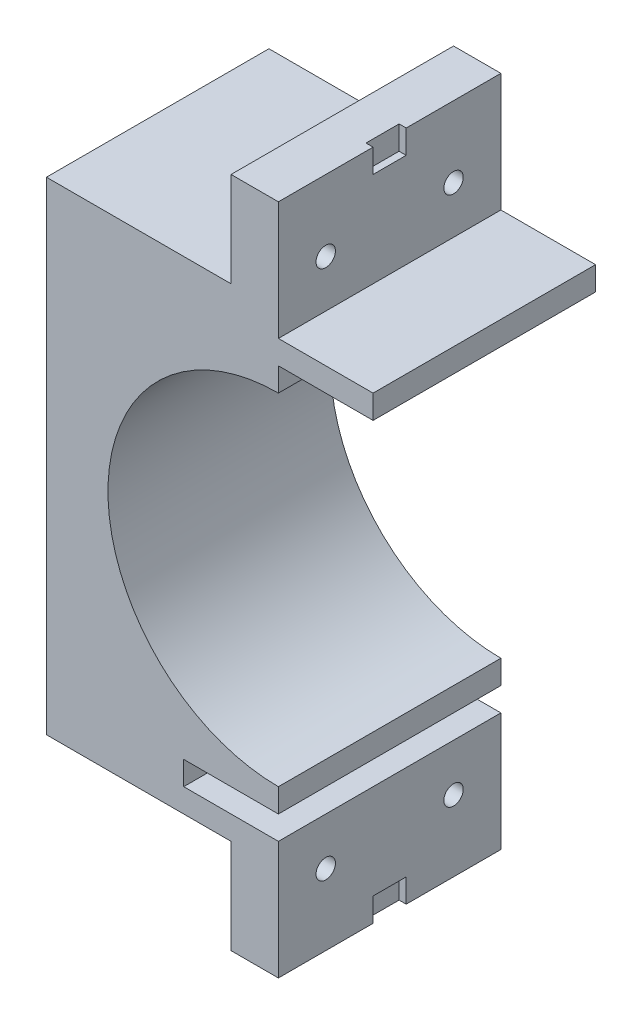
ISO-10303-21;
HEADER;
FILE_DESCRIPTION(('STEP AP214'),'2;1');
FILE_NAME('part.step','',(''),(''),'','','');
FILE_SCHEMA(('AUTOMOTIVE_DESIGN { 1 0 10303 214 1 1 1 1 }'));
ENDSEC;
DATA;
#1=APPLICATION_CONTEXT('core data for automotive mechanical design processes');
#2=APPLICATION_PROTOCOL_DEFINITION('international standard','automotive_design',2000,#1);
#3=PRODUCT_CONTEXT('',#1,'mechanical');
#4=PRODUCT('Part','Part','',(#3));
#5=PRODUCT_RELATED_PRODUCT_CATEGORY('part','',(#4));
#6=PRODUCT_DEFINITION_FORMATION('','',#4);
#7=PRODUCT_DEFINITION_CONTEXT('part definition',#1,'design');
#8=PRODUCT_DEFINITION('design','',#6,#7);
#9=PRODUCT_DEFINITION_SHAPE('','',#8);
#10=(LENGTH_UNIT() NAMED_UNIT(*) SI_UNIT(.MILLI.,.METRE.));
#11=(NAMED_UNIT(*) PLANE_ANGLE_UNIT() SI_UNIT($,.RADIAN.));
#12=(NAMED_UNIT(*) SI_UNIT($,.STERADIAN.) SOLID_ANGLE_UNIT());
#13=UNCERTAINTY_MEASURE_WITH_UNIT(LENGTH_MEASURE(1.E-05),#10,'distance_accuracy_value','');
#14=(GEOMETRIC_REPRESENTATION_CONTEXT(3) GLOBAL_UNCERTAINTY_ASSIGNED_CONTEXT((#13)) GLOBAL_UNIT_ASSIGNED_CONTEXT((#10,
#11,#12)) REPRESENTATION_CONTEXT('',''));
#15=CARTESIAN_POINT('',(0.,0.,0.));
#16=DIRECTION('',(0.,0.,1.));
#17=DIRECTION('',(1.,0.,0.));
#18=AXIS2_PLACEMENT_3D('',#15,#16,#17);
#19=CARTESIAN_POINT('',(0.,-51.,47.));
#20=DIRECTION('',(-1.,0.,0.));
#21=DIRECTION('',(0.,0.,1.));
#22=AXIS2_PLACEMENT_3D('',#19,#20,#21);
#23=PLANE('',#22);
#24=CARTESIAN_POINT('',(0.,-56.,10.));
#25=DIRECTION('',(-1.,0.,0.));
#26=DIRECTION('',(0.,0.,1.));
#27=AXIS2_PLACEMENT_3D('',#24,#25,#26);
#28=CIRCLE('',#27,2.05);
#29=CARTESIAN_POINT('',(0.,-56.,12.05));
#30=VERTEX_POINT('',#29);
#31=EDGE_CURVE('E339',#30,#30,#28,.T.);
#32=ORIENTED_EDGE('',*,*,#31,.T.);
#33=EDGE_LOOP('',(#32));
#34=FACE_BOUND('',#33,.T.);
#35=CARTESIAN_POINT('',(0.,-56.,37.));
#36=DIRECTION('',(-1.,0.,0.));
#37=DIRECTION('',(0.,0.,1.));
#38=AXIS2_PLACEMENT_3D('',#35,#36,#37);
#39=CIRCLE('',#38,2.04999999999999);
#40=CARTESIAN_POINT('',(0.,-56.,39.05));
#41=VERTEX_POINT('',#40);
#42=EDGE_CURVE('E330',#41,#41,#39,.T.);
#43=ORIENTED_EDGE('',*,*,#42,.T.);
#44=EDGE_LOOP('',(#43));
#45=FACE_BOUND('',#44,.T.);
#46=DIRECTION('',(0.,0.,1.));
#47=VECTOR('',#46,1.);
#48=CARTESIAN_POINT('',(0.,-66.,27.));
#49=LINE('',#48,#47);
#50=CARTESIAN_POINT('',(0.,-66.,20.));
#51=VERTEX_POINT('',#50);
#52=CARTESIAN_POINT('',(0.,-66.,27.));
#53=VERTEX_POINT('',#52);
#54=EDGE_CURVE('E298',#51,#53,#49,.T.);
#55=ORIENTED_EDGE('',*,*,#54,.F.);
#56=DIRECTION('',(0.,-1.,0.));
#57=VECTOR('',#56,1.);
#58=CARTESIAN_POINT('',(0.,-66.,20.));
#59=LINE('',#58,#57);
#60=CARTESIAN_POINT('',(0.,-71.,20.));
#61=VERTEX_POINT('',#60);
#62=EDGE_CURVE('E318',#51,#61,#59,.T.);
#63=ORIENTED_EDGE('',*,*,#62,.T.);
#64=DIRECTION('',(0.,0.,-1.));
#65=VECTOR('',#64,1.);
#66=CARTESIAN_POINT('',(0.,-71.,47.));
#67=LINE('',#66,#65);
#68=CARTESIAN_POINT('',(0.,-71.,0.));
#69=VERTEX_POINT('',#68);
#70=EDGE_CURVE('E428',#61,#69,#67,.T.);
#71=ORIENTED_EDGE('',*,*,#70,.T.);
#72=DIRECTION('',(0.,1.,0.));
#73=VECTOR('',#72,1.);
#74=CARTESIAN_POINT('',(0.,-51.,0.));
#75=LINE('',#74,#73);
#76=CARTESIAN_POINT('',(0.,-46.,0.));
#77=VERTEX_POINT('',#76);
#78=EDGE_CURVE('E448',#69,#77,#75,.T.);
#79=ORIENTED_EDGE('',*,*,#78,.T.);
#80=DIRECTION('',(0.,0.,1.));
#81=VECTOR('',#80,1.);
#82=CARTESIAN_POINT('',(0.,-46.,0.));
#83=LINE('',#82,#81);
#84=CARTESIAN_POINT('',(0.,-46.,47.));
#85=VERTEX_POINT('',#84);
#86=EDGE_CURVE('E368',#77,#85,#83,.T.);
#87=ORIENTED_EDGE('',*,*,#86,.T.);
#88=DIRECTION('',(0.,1.,0.));
#89=VECTOR('',#88,1.);
#90=CARTESIAN_POINT('',(0.,-51.,47.));
#91=LINE('',#90,#89);
#92=CARTESIAN_POINT('',(0.,-71.,47.));
#93=VERTEX_POINT('',#92);
#94=EDGE_CURVE('E460',#93,#85,#91,.T.);
#95=ORIENTED_EDGE('',*,*,#94,.F.);
#96=CARTESIAN_POINT('',(0.,-71.,27.));
#97=VERTEX_POINT('',#96);
#98=EDGE_CURVE('E424',#93,#97,#67,.T.);
#99=ORIENTED_EDGE('',*,*,#98,.T.);
#100=DIRECTION('',(0.,-1.,0.));
#101=VECTOR('',#100,1.);
#102=CARTESIAN_POINT('',(0.,-66.,27.));
#103=LINE('',#102,#101);
#104=EDGE_CURVE('E311',#53,#97,#103,.T.);
#105=ORIENTED_EDGE('',*,*,#104,.F.);
#106=EDGE_LOOP('',(#55,#63,#71,#79,#87,#95,#99,#105));
#107=FACE_BOUND('',#106,.T.);
#108=ADVANCED_FACE('F43',(#34,#45,#107),#23,.F.);
#109=CARTESIAN_POINT('',(0.,36.,47.));
#110=DIRECTION('',(-1.,0.,0.));
#111=DIRECTION('',(0.,0.,1.));
#112=AXIS2_PLACEMENT_3D('',#109,#110,#111);
#113=PLANE('',#112);
#114=CARTESIAN_POINT('',(0.,56.,10.));
#115=DIRECTION('',(-1.,0.,0.));
#116=DIRECTION('',(0.,0.,1.));
#117=AXIS2_PLACEMENT_3D('',#114,#115,#116);
#118=CIRCLE('',#117,2.05);
#119=CARTESIAN_POINT('',(0.,56.,12.05));
#120=VERTEX_POINT('',#119);
#121=EDGE_CURVE('E327',#120,#120,#118,.T.);
#122=ORIENTED_EDGE('',*,*,#121,.T.);
#123=EDGE_LOOP('',(#122));
#124=FACE_BOUND('',#123,.T.);
#125=CARTESIAN_POINT('',(0.,56.,37.));
#126=DIRECTION('',(-1.,0.,0.));
#127=DIRECTION('',(0.,0.,1.));
#128=AXIS2_PLACEMENT_3D('',#125,#126,#127);
#129=CIRCLE('',#128,2.04999999999999);
#130=CARTESIAN_POINT('',(0.,56.,39.05));
#131=VERTEX_POINT('',#130);
#132=EDGE_CURVE('E321',#131,#131,#129,.T.);
#133=ORIENTED_EDGE('',*,*,#132,.T.);
#134=EDGE_LOOP('',(#133));
#135=FACE_BOUND('',#134,.T.);
#136=DIRECTION('',(0.,0.,-1.));
#137=VECTOR('',#136,1.);
#138=CARTESIAN_POINT('',(0.,66.,27.));
#139=LINE('',#138,#137);
#140=CARTESIAN_POINT('',(0.,66.,27.));
#141=VERTEX_POINT('',#140);
#142=CARTESIAN_POINT('',(0.,66.,20.));
#143=VERTEX_POINT('',#142);
#144=EDGE_CURVE('E269',#141,#143,#139,.T.);
#145=ORIENTED_EDGE('',*,*,#144,.F.);
#146=DIRECTION('',(0.,1.,0.));
#147=VECTOR('',#146,1.);
#148=CARTESIAN_POINT('',(0.,66.,27.));
#149=LINE('',#148,#147);
#150=CARTESIAN_POINT('',(0.,71.,27.));
#151=VERTEX_POINT('',#150);
#152=EDGE_CURVE('E289',#141,#151,#149,.T.);
#153=ORIENTED_EDGE('',*,*,#152,.T.);
#154=DIRECTION('',(0.,0.,1.));
#155=VECTOR('',#154,1.);
#156=CARTESIAN_POINT('',(0.,71.,47.));
#157=LINE('',#156,#155);
#158=CARTESIAN_POINT('',(0.,71.,47.));
#159=VERTEX_POINT('',#158);
#160=EDGE_CURVE('E409',#151,#159,#157,.T.);
#161=ORIENTED_EDGE('',*,*,#160,.T.);
#162=DIRECTION('',(0.,1.,0.));
#163=VECTOR('',#162,1.);
#164=CARTESIAN_POINT('',(0.,36.,47.));
#165=LINE('',#164,#163);
#166=CARTESIAN_POINT('',(0.,46.,47.));
#167=VERTEX_POINT('',#166);
#168=EDGE_CURVE('E447',#167,#159,#165,.T.);
#169=ORIENTED_EDGE('',*,*,#168,.F.);
#170=DIRECTION('',(0.,0.,1.));
#171=VECTOR('',#170,1.);
#172=CARTESIAN_POINT('',(0.,46.,0.));
#173=LINE('',#172,#171);
#174=CARTESIAN_POINT('',(0.,46.,0.));
#175=VERTEX_POINT('',#174);
#176=EDGE_CURVE('E395',#175,#167,#173,.T.);
#177=ORIENTED_EDGE('',*,*,#176,.F.);
#178=DIRECTION('',(0.,1.,0.));
#179=VECTOR('',#178,1.);
#180=CARTESIAN_POINT('',(0.,36.,0.));
#181=LINE('',#180,#179);
#182=CARTESIAN_POINT('',(0.,71.,0.));
#183=VERTEX_POINT('',#182);
#184=EDGE_CURVE('E466',#175,#183,#181,.T.);
#185=ORIENTED_EDGE('',*,*,#184,.T.);
#186=CARTESIAN_POINT('',(0.,71.,20.));
#187=VERTEX_POINT('',#186);
#188=EDGE_CURVE('E413',#183,#187,#157,.T.);
#189=ORIENTED_EDGE('',*,*,#188,.T.);
#190=DIRECTION('',(0.,1.,0.));
#191=VECTOR('',#190,1.);
#192=CARTESIAN_POINT('',(0.,66.,20.));
#193=LINE('',#192,#191);
#194=EDGE_CURVE('E66',#143,#187,#193,.T.);
#195=ORIENTED_EDGE('',*,*,#194,.F.);
#196=EDGE_LOOP('',(#145,#153,#161,#169,#177,#185,#189,#195));
#197=FACE_BOUND('',#196,.T.);
#198=ADVANCED_FACE('F535',(#124,#135,#197),#113,.F.);
#199=CARTESIAN_POINT('',(0.,0.,47.));
#200=DIRECTION('',(0.,0.,-1.));
#201=DIRECTION('',(-1.,0.,0.));
#202=AXIS2_PLACEMENT_3D('',#199,#200,#201);
#203=CYLINDRICAL_SURFACE('',#202,36.);
#204=CARTESIAN_POINT('',(0.,0.,0.));
#205=DIRECTION('',(0.,0.,-1.));
#206=DIRECTION('',(1.,0.,0.));
#207=AXIS2_PLACEMENT_3D('',#204,#205,#206);
#208=CIRCLE('',#207,36.);
#209=CARTESIAN_POINT('',(0.,-36.,0.));
#210=VERTEX_POINT('',#209);
#211=CARTESIAN_POINT('',(0.,36.,0.));
#212=VERTEX_POINT('',#211);
#213=EDGE_CURVE('E443',#210,#212,#208,.T.);
#214=ORIENTED_EDGE('',*,*,#213,.T.);
#215=DIRECTION('',(0.,0.,-1.));
#216=VECTOR('',#215,1.);
#217=CARTESIAN_POINT('',(0.,36.,47.));
#218=LINE('',#217,#216);
#219=CARTESIAN_POINT('',(0.,36.,47.));
#220=VERTEX_POINT('',#219);
#221=EDGE_CURVE('E11',#220,#212,#218,.T.);
#222=ORIENTED_EDGE('',*,*,#221,.F.);
#223=CARTESIAN_POINT('',(0.,0.,47.));
#224=DIRECTION('',(0.,0.,-1.));
#225=DIRECTION('',(1.,0.,0.));
#226=AXIS2_PLACEMENT_3D('',#223,#224,#225);
#227=CIRCLE('',#226,36.);
#228=CARTESIAN_POINT('',(0.,-36.,47.));
#229=VERTEX_POINT('',#228);
#230=EDGE_CURVE('E444',#229,#220,#227,.T.);
#231=ORIENTED_EDGE('',*,*,#230,.F.);
#232=DIRECTION('',(0.,0.,-1.));
#233=VECTOR('',#232,1.);
#234=CARTESIAN_POINT('',(0.,-36.,47.));
#235=LINE('',#234,#233);
#236=EDGE_CURVE('E463',#229,#210,#235,.T.);
#237=ORIENTED_EDGE('',*,*,#236,.T.);
#238=EDGE_LOOP('',(#214,#222,#231,#237));
#239=FACE_BOUND('',#238,.T.);
#240=ADVANCED_FACE('F45',(#239),#203,.F.);
#241=CARTESIAN_POINT('',(0.,41.,0.));
#242=VERTEX_POINT('',#241);
#243=EDGE_CURVE('E467',#212,#242,#181,.T.);
#244=ORIENTED_EDGE('',*,*,#243,.T.);
#245=DIRECTION('',(0.,0.,1.));
#246=VECTOR('',#245,1.);
#247=CARTESIAN_POINT('',(0.,41.,0.));
#248=LINE('',#247,#246);
#249=CARTESIAN_POINT('',(0.,41.,47.));
#250=VERTEX_POINT('',#249);
#251=EDGE_CURVE('E387',#242,#250,#248,.T.);
#252=ORIENTED_EDGE('',*,*,#251,.T.);
#253=EDGE_CURVE('E449',#220,#250,#165,.T.);
#254=ORIENTED_EDGE('',*,*,#253,.F.);
#255=ORIENTED_EDGE('',*,*,#221,.T.);
#256=EDGE_LOOP('',(#244,#252,#254,#255));
#257=FACE_BOUND('',#256,.T.);
#258=ADVANCED_FACE('F554',(#257),#113,.F.);
#259=CARTESIAN_POINT('',(0.,51.,47.));
#260=DIRECTION('',(0.,-1.,0.));
#261=DIRECTION('',(0.,0.,-1.));
#262=AXIS2_PLACEMENT_3D('',#259,#260,#261);
#263=PLANE('',#262);
#264=DIRECTION('',(-1.,0.,0.));
#265=VECTOR('',#264,1.);
#266=CARTESIAN_POINT('',(0.,51.,47.));
#267=LINE('',#266,#265);
#268=CARTESIAN_POINT('',(-10.,51.,47.));
#269=VERTEX_POINT('',#268);
#270=CARTESIAN_POINT('',(-49.,51.,47.));
#271=VERTEX_POINT('',#270);
#272=EDGE_CURVE('E452',#269,#271,#267,.T.);
#273=ORIENTED_EDGE('',*,*,#272,.F.);
#274=DIRECTION('',(0.,0.,-1.));
#275=VECTOR('',#274,1.);
#276=CARTESIAN_POINT('',(-10.,51.,47.));
#277=LINE('',#276,#275);
#278=CARTESIAN_POINT('',(-10.,51.,0.));
#279=VERTEX_POINT('',#278);
#280=EDGE_CURVE('E415',#269,#279,#277,.T.);
#281=ORIENTED_EDGE('',*,*,#280,.T.);
#282=DIRECTION('',(-1.,0.,0.));
#283=VECTOR('',#282,1.);
#284=CARTESIAN_POINT('',(0.,51.,0.));
#285=LINE('',#284,#283);
#286=CARTESIAN_POINT('',(-49.,51.,0.));
#287=VERTEX_POINT('',#286);
#288=EDGE_CURVE('E469',#279,#287,#285,.T.);
#289=ORIENTED_EDGE('',*,*,#288,.T.);
#290=DIRECTION('',(0.,0.,-1.));
#291=VECTOR('',#290,1.);
#292=CARTESIAN_POINT('',(-49.,51.,47.));
#293=LINE('',#292,#291);
#294=EDGE_CURVE('E51',#271,#287,#293,.T.);
#295=ORIENTED_EDGE('',*,*,#294,.F.);
#296=EDGE_LOOP('',(#273,#281,#289,#295));
#297=FACE_BOUND('',#296,.T.);
#298=ADVANCED_FACE('F522',(#297),#263,.F.);
#299=CARTESIAN_POINT('',(-49.,51.,47.));
#300=DIRECTION('',(1.,0.,0.));
#301=DIRECTION('',(0.,1.,0.));
#302=AXIS2_PLACEMENT_3D('',#299,#300,#301);
#303=PLANE('',#302);
#304=DIRECTION('',(0.,-1.,0.));
#305=VECTOR('',#304,1.);
#306=CARTESIAN_POINT('',(-49.,51.,0.));
#307=LINE('',#306,#305);
#308=CARTESIAN_POINT('',(-49.,3.5,0.));
#309=VERTEX_POINT('',#308);
#310=EDGE_CURVE('E471',#287,#309,#307,.T.);
#311=ORIENTED_EDGE('',*,*,#310,.T.);
#312=DIRECTION('',(0.,0.,-1.));
#313=VECTOR('',#312,1.);
#314=CARTESIAN_POINT('',(-49.,3.5,0.));
#315=LINE('',#314,#313);
#316=CARTESIAN_POINT('',(-49.,3.5,1.8));
#317=VERTEX_POINT('',#316);
#318=EDGE_CURVE('E257',#317,#309,#315,.T.);
#319=ORIENTED_EDGE('',*,*,#318,.F.);
#320=DIRECTION('',(0.,1.,0.));
#321=VECTOR('',#320,1.);
#322=CARTESIAN_POINT('',(-49.,-3.5,1.8));
#323=LINE('',#322,#321);
#324=CARTESIAN_POINT('',(-49.,-3.5,1.8));
#325=VERTEX_POINT('',#324);
#326=EDGE_CURVE('E499',#325,#317,#323,.T.);
#327=ORIENTED_EDGE('',*,*,#326,.F.);
#328=DIRECTION('',(0.,0.,1.));
#329=VECTOR('',#328,1.);
#330=CARTESIAN_POINT('',(-49.,-3.5,0.));
#331=LINE('',#330,#329);
#332=CARTESIAN_POINT('',(-49.,-3.5,0.));
#333=VERTEX_POINT('',#332);
#334=EDGE_CURVE('E502',#333,#325,#331,.T.);
#335=ORIENTED_EDGE('',*,*,#334,.F.);
#336=CARTESIAN_POINT('',(-49.,-51.,0.));
#337=VERTEX_POINT('',#336);
#338=EDGE_CURVE('E262',#333,#337,#307,.T.);
#339=ORIENTED_EDGE('',*,*,#338,.T.);
#340=DIRECTION('',(0.,0.,-1.));
#341=VECTOR('',#340,1.);
#342=CARTESIAN_POINT('',(-49.,-51.,47.));
#343=LINE('',#342,#341);
#344=CARTESIAN_POINT('',(-49.,-51.,47.));
#345=VERTEX_POINT('',#344);
#346=EDGE_CURVE('E482',#345,#337,#343,.T.);
#347=ORIENTED_EDGE('',*,*,#346,.F.);
#348=DIRECTION('',(0.,-1.,0.));
#349=VECTOR('',#348,1.);
#350=CARTESIAN_POINT('',(-49.,51.,47.));
#351=LINE('',#350,#349);
#352=EDGE_CURVE('E454',#271,#345,#351,.T.);
#353=ORIENTED_EDGE('',*,*,#352,.F.);
#354=ORIENTED_EDGE('',*,*,#294,.T.);
#355=EDGE_LOOP('',(#311,#319,#327,#335,#339,#347,#353,#354));
#356=FACE_BOUND('',#355,.T.);
#357=ADVANCED_FACE('F489',(#356),#303,.F.);
#358=CARTESIAN_POINT('',(-49.,-51.,47.));
#359=DIRECTION('',(0.,1.,0.));
#360=DIRECTION('',(0.,0.,1.));
#361=AXIS2_PLACEMENT_3D('',#358,#359,#360);
#362=PLANE('',#361);
#363=DIRECTION('',(1.,0.,0.));
#364=VECTOR('',#363,1.);
#365=CARTESIAN_POINT('',(-49.,-51.,0.));
#366=LINE('',#365,#364);
#367=CARTESIAN_POINT('',(-10.,-51.,0.));
#368=VERTEX_POINT('',#367);
#369=EDGE_CURVE('E474',#337,#368,#366,.T.);
#370=ORIENTED_EDGE('',*,*,#369,.T.);
#371=DIRECTION('',(0.,0.,1.));
#372=VECTOR('',#371,1.);
#373=CARTESIAN_POINT('',(-10.,-51.,47.));
#374=LINE('',#373,#372);
#375=CARTESIAN_POINT('',(-10.,-51.,47.));
#376=VERTEX_POINT('',#375);
#377=EDGE_CURVE('E435',#368,#376,#374,.T.);
#378=ORIENTED_EDGE('',*,*,#377,.T.);
#379=DIRECTION('',(1.,0.,0.));
#380=VECTOR('',#379,1.);
#381=CARTESIAN_POINT('',(-49.,-51.,47.));
#382=LINE('',#381,#380);
#383=EDGE_CURVE('E456',#345,#376,#382,.T.);
#384=ORIENTED_EDGE('',*,*,#383,.F.);
#385=ORIENTED_EDGE('',*,*,#346,.T.);
#386=EDGE_LOOP('',(#370,#378,#384,#385));
#387=FACE_BOUND('',#386,.T.);
#388=ADVANCED_FACE('F510',(#387),#362,.F.);
#389=CARTESIAN_POINT('',(0.,-41.,47.));
#390=VERTEX_POINT('',#389);
#391=EDGE_CURVE('E459',#390,#229,#91,.T.);
#392=ORIENTED_EDGE('',*,*,#391,.F.);
#393=DIRECTION('',(0.,0.,1.));
#394=VECTOR('',#393,1.);
#395=CARTESIAN_POINT('',(0.,-41.,0.));
#396=LINE('',#395,#394);
#397=CARTESIAN_POINT('',(0.,-41.,0.));
#398=VERTEX_POINT('',#397);
#399=EDGE_CURVE('E361',#398,#390,#396,.T.);
#400=ORIENTED_EDGE('',*,*,#399,.F.);
#401=EDGE_CURVE('E477',#398,#210,#75,.T.);
#402=ORIENTED_EDGE('',*,*,#401,.T.);
#403=ORIENTED_EDGE('',*,*,#236,.F.);
#404=EDGE_LOOP('',(#392,#400,#402,#403));
#405=FACE_BOUND('',#404,.T.);
#406=ADVANCED_FACE('F560',(#405),#23,.F.);
#407=CARTESIAN_POINT('',(0.,0.,47.));
#408=DIRECTION('',(0.,0.,1.));
#409=DIRECTION('',(1.,0.,0.));
#410=AXIS2_PLACEMENT_3D('',#407,#408,#409);
#411=PLANE('',#410);
#412=DIRECTION('',(1.,0.,0.));
#413=VECTOR('',#412,1.);
#414=CARTESIAN_POINT('',(0.,-46.,47.));
#415=LINE('',#414,#413);
#416=CARTESIAN_POINT('',(-20.,-46.,47.));
#417=VERTEX_POINT('',#416);
#418=EDGE_CURVE('E355',#417,#85,#415,.T.);
#419=ORIENTED_EDGE('',*,*,#418,.F.);
#420=DIRECTION('',(0.,-1.,0.));
#421=VECTOR('',#420,1.);
#422=CARTESIAN_POINT('',(-20.,-41.,47.));
#423=LINE('',#422,#421);
#424=CARTESIAN_POINT('',(-20.,-41.,47.));
#425=VERTEX_POINT('',#424);
#426=EDGE_CURVE('E364',#425,#417,#423,.T.);
#427=ORIENTED_EDGE('',*,*,#426,.F.);
#428=DIRECTION('',(-1.,0.,0.));
#429=VECTOR('',#428,1.);
#430=CARTESIAN_POINT('',(0.,-41.,47.));
#431=LINE('',#430,#429);
#432=EDGE_CURVE('E342',#390,#425,#431,.T.);
#433=ORIENTED_EDGE('',*,*,#432,.F.);
#434=ORIENTED_EDGE('',*,*,#391,.T.);
#435=ORIENTED_EDGE('',*,*,#230,.T.);
#436=ORIENTED_EDGE('',*,*,#253,.T.);
#437=DIRECTION('',(1.,0.,0.));
#438=VECTOR('',#437,1.);
#439=CARTESIAN_POINT('',(0.,41.,47.));
#440=LINE('',#439,#438);
#441=CARTESIAN_POINT('',(20.,41.,47.));
#442=VERTEX_POINT('',#441);
#443=EDGE_CURVE('E371',#250,#442,#440,.T.);
#444=ORIENTED_EDGE('',*,*,#443,.T.);
#445=DIRECTION('',(0.,1.,0.));
#446=VECTOR('',#445,1.);
#447=CARTESIAN_POINT('',(20.,46.,47.));
#448=LINE('',#447,#446);
#449=CARTESIAN_POINT('',(20.,46.,47.));
#450=VERTEX_POINT('',#449);
#451=EDGE_CURVE('E390',#442,#450,#448,.T.);
#452=ORIENTED_EDGE('',*,*,#451,.T.);
#453=DIRECTION('',(-1.,0.,0.));
#454=VECTOR('',#453,1.);
#455=CARTESIAN_POINT('',(0.,46.,47.));
#456=LINE('',#455,#454);
#457=EDGE_CURVE('E381',#450,#167,#456,.T.);
#458=ORIENTED_EDGE('',*,*,#457,.T.);
#459=ORIENTED_EDGE('',*,*,#168,.T.);
#460=DIRECTION('',(-1.,0.,0.));
#461=VECTOR('',#460,1.);
#462=CARTESIAN_POINT('',(0.,71.,47.));
#463=LINE('',#462,#461);
#464=CARTESIAN_POINT('',(-10.,71.,47.));
#465=VERTEX_POINT('',#464);
#466=EDGE_CURVE('E406',#159,#465,#463,.T.);
#467=ORIENTED_EDGE('',*,*,#466,.T.);
#468=DIRECTION('',(0.,-1.,0.));
#469=VECTOR('',#468,1.);
#470=CARTESIAN_POINT('',(-10.,51.,47.));
#471=LINE('',#470,#469);
#472=EDGE_CURVE('E418',#465,#269,#471,.T.);
#473=ORIENTED_EDGE('',*,*,#472,.T.);
#474=ORIENTED_EDGE('',*,*,#272,.T.);
#475=ORIENTED_EDGE('',*,*,#352,.T.);
#476=ORIENTED_EDGE('',*,*,#383,.T.);
#477=DIRECTION('',(0.,-1.,0.));
#478=VECTOR('',#477,1.);
#479=CARTESIAN_POINT('',(-10.,-51.,47.));
#480=LINE('',#479,#478);
#481=CARTESIAN_POINT('',(-10.,-71.,47.));
#482=VERTEX_POINT('',#481);
#483=EDGE_CURVE('E421',#376,#482,#480,.T.);
#484=ORIENTED_EDGE('',*,*,#483,.T.);
#485=DIRECTION('',(-1.,0.,0.));
#486=VECTOR('',#485,1.);
#487=CARTESIAN_POINT('',(0.,-71.,47.));
#488=LINE('',#487,#486);
#489=EDGE_CURVE('E440',#93,#482,#488,.T.);
#490=ORIENTED_EDGE('',*,*,#489,.F.);
#491=ORIENTED_EDGE('',*,*,#94,.T.);
#492=EDGE_LOOP('',(#419,#427,#433,#434,#435,#436,#444,#452,#458,#459,#467,#473,#474,#475,#476,
#484,#490,#491));
#493=FACE_BOUND('',#492,.T.);
#494=ADVANCED_FACE('F519',(#493),#411,.T.);
#495=CARTESIAN_POINT('',(0.,0.,0.));
#496=DIRECTION('',(0.,0.,1.));
#497=DIRECTION('',(1.,0.,0.));
#498=AXIS2_PLACEMENT_3D('',#495,#496,#497);
#499=PLANE('',#498);
#500=DIRECTION('',(0.,-1.,0.));
#501=VECTOR('',#500,1.);
#502=CARTESIAN_POINT('',(-43.,-3.5,0.));
#503=LINE('',#502,#501);
#504=CARTESIAN_POINT('',(-43.,3.5,0.));
#505=VERTEX_POINT('',#504);
#506=CARTESIAN_POINT('',(-43.,-3.5,0.));
#507=VERTEX_POINT('',#506);
#508=EDGE_CURVE('E251',#505,#507,#503,.T.);
#509=ORIENTED_EDGE('',*,*,#508,.F.);
#510=DIRECTION('',(-1.,0.,0.));
#511=VECTOR('',#510,1.);
#512=CARTESIAN_POINT('',(-43.,3.5,0.));
#513=LINE('',#512,#511);
#514=EDGE_CURVE('E285',#505,#309,#513,.T.);
#515=ORIENTED_EDGE('',*,*,#514,.T.);
#516=ORIENTED_EDGE('',*,*,#310,.F.);
#517=ORIENTED_EDGE('',*,*,#288,.F.);
#518=DIRECTION('',(0.,1.,0.));
#519=VECTOR('',#518,1.);
#520=CARTESIAN_POINT('',(-10.,51.,0.));
#521=LINE('',#520,#519);
#522=CARTESIAN_POINT('',(-10.,71.,0.));
#523=VERTEX_POINT('',#522);
#524=EDGE_CURVE('E412',#279,#523,#521,.T.);
#525=ORIENTED_EDGE('',*,*,#524,.T.);
#526=DIRECTION('',(-1.,0.,0.));
#527=VECTOR('',#526,1.);
#528=CARTESIAN_POINT('',(0.,71.,0.));
#529=LINE('',#528,#527);
#530=EDGE_CURVE('E398',#183,#523,#529,.T.);
#531=ORIENTED_EDGE('',*,*,#530,.F.);
#532=ORIENTED_EDGE('',*,*,#184,.F.);
#533=DIRECTION('',(-1.,0.,0.));
#534=VECTOR('',#533,1.);
#535=CARTESIAN_POINT('',(0.,46.,0.));
#536=LINE('',#535,#534);
#537=CARTESIAN_POINT('',(20.,46.,0.));
#538=VERTEX_POINT('',#537);
#539=EDGE_CURVE('E384',#538,#175,#536,.T.);
#540=ORIENTED_EDGE('',*,*,#539,.F.);
#541=DIRECTION('',(0.,1.,0.));
#542=VECTOR('',#541,1.);
#543=CARTESIAN_POINT('',(20.,46.,0.));
#544=LINE('',#543,#542);
#545=CARTESIAN_POINT('',(20.,41.,0.));
#546=VERTEX_POINT('',#545);
#547=EDGE_CURVE('E380',#546,#538,#544,.T.);
#548=ORIENTED_EDGE('',*,*,#547,.F.);
#549=DIRECTION('',(1.,0.,0.));
#550=VECTOR('',#549,1.);
#551=CARTESIAN_POINT('',(0.,41.,0.));
#552=LINE('',#551,#550);
#553=EDGE_CURVE('E377',#242,#546,#552,.T.);
#554=ORIENTED_EDGE('',*,*,#553,.F.);
#555=ORIENTED_EDGE('',*,*,#243,.F.);
#556=ORIENTED_EDGE('',*,*,#213,.F.);
#557=ORIENTED_EDGE('',*,*,#401,.F.);
#558=DIRECTION('',(-1.,0.,0.));
#559=VECTOR('',#558,1.);
#560=CARTESIAN_POINT('',(0.,-41.,0.));
#561=LINE('',#560,#559);
#562=CARTESIAN_POINT('',(-20.,-41.,0.));
#563=VERTEX_POINT('',#562);
#564=EDGE_CURVE('E351',#398,#563,#561,.T.);
#565=ORIENTED_EDGE('',*,*,#564,.T.);
#566=DIRECTION('',(0.,-1.,0.));
#567=VECTOR('',#566,1.);
#568=CARTESIAN_POINT('',(-20.,-41.,0.));
#569=LINE('',#568,#567);
#570=CARTESIAN_POINT('',(-20.,-46.,0.));
#571=VERTEX_POINT('',#570);
#572=EDGE_CURVE('E354',#563,#571,#569,.T.);
#573=ORIENTED_EDGE('',*,*,#572,.T.);
#574=DIRECTION('',(1.,0.,0.));
#575=VECTOR('',#574,1.);
#576=CARTESIAN_POINT('',(0.,-46.,0.));
#577=LINE('',#576,#575);
#578=EDGE_CURVE('E358',#571,#77,#577,.T.);
#579=ORIENTED_EDGE('',*,*,#578,.T.);
#580=ORIENTED_EDGE('',*,*,#78,.F.);
#581=DIRECTION('',(-1.,0.,0.));
#582=VECTOR('',#581,1.);
#583=CARTESIAN_POINT('',(0.,-71.,0.));
#584=LINE('',#583,#582);
#585=CARTESIAN_POINT('',(-10.,-71.,0.));
#586=VERTEX_POINT('',#585);
#587=EDGE_CURVE('E427',#69,#586,#584,.T.);
#588=ORIENTED_EDGE('',*,*,#587,.T.);
#589=DIRECTION('',(0.,1.,0.));
#590=VECTOR('',#589,1.);
#591=CARTESIAN_POINT('',(-10.,-51.,0.));
#592=LINE('',#591,#590);
#593=EDGE_CURVE('E433',#586,#368,#592,.T.);
#594=ORIENTED_EDGE('',*,*,#593,.T.);
#595=ORIENTED_EDGE('',*,*,#369,.F.);
#596=ORIENTED_EDGE('',*,*,#338,.F.);
#597=DIRECTION('',(-1.,0.,0.));
#598=VECTOR('',#597,1.);
#599=CARTESIAN_POINT('',(-43.,-3.5,0.));
#600=LINE('',#599,#598);
#601=EDGE_CURVE('E246',#507,#333,#600,.T.);
#602=ORIENTED_EDGE('',*,*,#601,.F.);
#603=EDGE_LOOP('',(#509,#515,#516,#517,#525,#531,#532,#540,#548,#554,#555,#556,#557,#565,#573,
#579,#580,#588,#594,#595,#596,#602));
#604=FACE_BOUND('',#603,.T.);
#605=ADVANCED_FACE('F260',(#604),#499,.F.);
#606=CARTESIAN_POINT('',(0.,-71.,47.));
#607=DIRECTION('',(0.,1.,0.));
#608=DIRECTION('',(0.,0.,1.));
#609=AXIS2_PLACEMENT_3D('',#606,#607,#608);
#610=PLANE('',#609);
#611=ORIENTED_EDGE('',*,*,#70,.F.);
#612=DIRECTION('',(1.,0.,0.));
#613=VECTOR('',#612,1.);
#614=CARTESIAN_POINT('',(0.,-71.,20.));
#615=LINE('',#614,#613);
#616=CARTESIAN_POINT('',(-1.5,-71.,20.));
#617=VERTEX_POINT('',#616);
#618=EDGE_CURVE('E302',#617,#61,#615,.T.);
#619=ORIENTED_EDGE('',*,*,#618,.F.);
#620=DIRECTION('',(0.,0.,-1.));
#621=VECTOR('',#620,1.);
#622=CARTESIAN_POINT('',(-1.5,-71.,27.));
#623=LINE('',#622,#621);
#624=CARTESIAN_POINT('',(-1.5,-71.,27.));
#625=VERTEX_POINT('',#624);
#626=EDGE_CURVE('E314',#625,#617,#623,.T.);
#627=ORIENTED_EDGE('',*,*,#626,.F.);
#628=DIRECTION('',(-1.,0.,0.));
#629=VECTOR('',#628,1.);
#630=CARTESIAN_POINT('',(0.,-71.,27.));
#631=LINE('',#630,#629);
#632=EDGE_CURVE('E292',#97,#625,#631,.T.);
#633=ORIENTED_EDGE('',*,*,#632,.F.);
#634=ORIENTED_EDGE('',*,*,#98,.F.);
#635=ORIENTED_EDGE('',*,*,#489,.T.);
#636=DIRECTION('',(0.,0.,-1.));
#637=VECTOR('',#636,1.);
#638=CARTESIAN_POINT('',(-10.,-71.,47.));
#639=LINE('',#638,#637);
#640=EDGE_CURVE('E431',#482,#586,#639,.T.);
#641=ORIENTED_EDGE('',*,*,#640,.T.);
#642=ORIENTED_EDGE('',*,*,#587,.F.);
#643=EDGE_LOOP('',(#611,#619,#627,#633,#634,#635,#641,#642));
#644=FACE_BOUND('',#643,.T.);
#645=ADVANCED_FACE('F577',(#644),#610,.F.);
#646=CARTESIAN_POINT('',(-10.,0.,0.));
#647=DIRECTION('',(1.,0.,0.));
#648=DIRECTION('',(0.,0.,-1.));
#649=AXIS2_PLACEMENT_3D('',#646,#647,#648);
#650=PLANE('',#649);
#651=CARTESIAN_POINT('',(-10.,-56.,10.));
#652=DIRECTION('',(-1.,0.,0.));
#653=DIRECTION('',(0.,0.,1.));
#654=AXIS2_PLACEMENT_3D('',#651,#652,#653);
#655=CIRCLE('',#654,2.05);
#656=CARTESIAN_POINT('',(-10.,-56.,12.05));
#657=VERTEX_POINT('',#656);
#658=EDGE_CURVE('E343',#657,#657,#655,.T.);
#659=ORIENTED_EDGE('',*,*,#658,.F.);
#660=EDGE_LOOP('',(#659));
#661=FACE_BOUND('',#660,.T.);
#662=CARTESIAN_POINT('',(-10.,-56.,37.));
#663=DIRECTION('',(-1.,0.,0.));
#664=DIRECTION('',(0.,0.,1.));
#665=AXIS2_PLACEMENT_3D('',#662,#663,#664);
#666=CIRCLE('',#665,2.04999999999999);
#667=CARTESIAN_POINT('',(-10.,-56.,39.05));
#668=VERTEX_POINT('',#667);
#669=EDGE_CURVE('E346',#668,#668,#666,.T.);
#670=ORIENTED_EDGE('',*,*,#669,.F.);
#671=EDGE_LOOP('',(#670));
#672=FACE_BOUND('',#671,.T.);
#673=ORIENTED_EDGE('',*,*,#483,.F.);
#674=ORIENTED_EDGE('',*,*,#377,.F.);
#675=ORIENTED_EDGE('',*,*,#593,.F.);
#676=ORIENTED_EDGE('',*,*,#640,.F.);
#677=EDGE_LOOP('',(#673,#674,#675,#676));
#678=FACE_BOUND('',#677,.T.);
#679=ADVANCED_FACE('F516',(#661,#672,#678),#650,.F.);
#680=CARTESIAN_POINT('',(0.,71.,47.));
#681=DIRECTION('',(0.,-1.,0.));
#682=DIRECTION('',(0.,0.,-1.));
#683=AXIS2_PLACEMENT_3D('',#680,#681,#682);
#684=PLANE('',#683);
#685=ORIENTED_EDGE('',*,*,#160,.F.);
#686=DIRECTION('',(1.,0.,0.));
#687=VECTOR('',#686,1.);
#688=CARTESIAN_POINT('',(-1.5,71.,27.));
#689=LINE('',#688,#687);
#690=CARTESIAN_POINT('',(-1.5,71.,27.));
#691=VERTEX_POINT('',#690);
#692=EDGE_CURVE('E273',#691,#151,#689,.T.);
#693=ORIENTED_EDGE('',*,*,#692,.F.);
#694=DIRECTION('',(0.,0.,1.));
#695=VECTOR('',#694,1.);
#696=CARTESIAN_POINT('',(-1.5,71.,20.));
#697=LINE('',#696,#695);
#698=CARTESIAN_POINT('',(-1.5,71.,20.));
#699=VERTEX_POINT('',#698);
#700=EDGE_CURVE('E284',#699,#691,#697,.T.);
#701=ORIENTED_EDGE('',*,*,#700,.F.);
#702=DIRECTION('',(-1.,0.,0.));
#703=VECTOR('',#702,1.);
#704=CARTESIAN_POINT('',(0.,71.,20.));
#705=LINE('',#704,#703);
#706=EDGE_CURVE('E282',#187,#699,#705,.T.);
#707=ORIENTED_EDGE('',*,*,#706,.F.);
#708=ORIENTED_EDGE('',*,*,#188,.F.);
#709=ORIENTED_EDGE('',*,*,#530,.T.);
#710=DIRECTION('',(0.,0.,1.));
#711=VECTOR('',#710,1.);
#712=CARTESIAN_POINT('',(-10.,71.,47.));
#713=LINE('',#712,#711);
#714=EDGE_CURVE('E410',#523,#465,#713,.T.);
#715=ORIENTED_EDGE('',*,*,#714,.T.);
#716=ORIENTED_EDGE('',*,*,#466,.F.);
#717=EDGE_LOOP('',(#685,#693,#701,#707,#708,#709,#715,#716));
#718=FACE_BOUND('',#717,.T.);
#719=ADVANCED_FACE('F530',(#718),#684,.F.);
#720=CARTESIAN_POINT('',(-10.,0.,0.));
#721=DIRECTION('',(-1.,0.,0.));
#722=DIRECTION('',(0.,0.,1.));
#723=AXIS2_PLACEMENT_3D('',#720,#721,#722);
#724=PLANE('',#723);
#725=CARTESIAN_POINT('',(-10.,56.,10.));
#726=DIRECTION('',(-1.,0.,0.));
#727=DIRECTION('',(0.,0.,1.));
#728=AXIS2_PLACEMENT_3D('',#725,#726,#727);
#729=CIRCLE('',#728,2.05);
#730=CARTESIAN_POINT('',(-10.,56.,12.05));
#731=VERTEX_POINT('',#730);
#732=EDGE_CURVE('E331',#731,#731,#729,.T.);
#733=ORIENTED_EDGE('',*,*,#732,.F.);
#734=EDGE_LOOP('',(#733));
#735=FACE_BOUND('',#734,.T.);
#736=CARTESIAN_POINT('',(-10.,56.,37.));
#737=DIRECTION('',(-1.,0.,0.));
#738=DIRECTION('',(0.,0.,1.));
#739=AXIS2_PLACEMENT_3D('',#736,#737,#738);
#740=CIRCLE('',#739,2.04999999999999);
#741=CARTESIAN_POINT('',(-10.,56.,39.05));
#742=VERTEX_POINT('',#741);
#743=EDGE_CURVE('E334',#742,#742,#740,.T.);
#744=ORIENTED_EDGE('',*,*,#743,.F.);
#745=EDGE_LOOP('',(#744));
#746=FACE_BOUND('',#745,.T.);
#747=ORIENTED_EDGE('',*,*,#472,.F.);
#748=ORIENTED_EDGE('',*,*,#714,.F.);
#749=ORIENTED_EDGE('',*,*,#524,.F.);
#750=ORIENTED_EDGE('',*,*,#280,.F.);
#751=EDGE_LOOP('',(#747,#748,#749,#750));
#752=FACE_BOUND('',#751,.T.);
#753=ADVANCED_FACE('F524',(#735,#746,#752),#724,.T.);
#754=CARTESIAN_POINT('',(0.,46.,0.));
#755=DIRECTION('',(0.,1.,0.));
#756=DIRECTION('',(0.,0.,1.));
#757=AXIS2_PLACEMENT_3D('',#754,#755,#756);
#758=PLANE('',#757);
#759=ORIENTED_EDGE('',*,*,#457,.F.);
#760=DIRECTION('',(0.,0.,1.));
#761=VECTOR('',#760,1.);
#762=CARTESIAN_POINT('',(20.,46.,0.));
#763=LINE('',#762,#761);
#764=EDGE_CURVE('E399',#538,#450,#763,.T.);
#765=ORIENTED_EDGE('',*,*,#764,.F.);
#766=ORIENTED_EDGE('',*,*,#539,.T.);
#767=ORIENTED_EDGE('',*,*,#176,.T.);
#768=EDGE_LOOP('',(#759,#765,#766,#767));
#769=FACE_BOUND('',#768,.T.);
#770=ADVANCED_FACE('F542',(#769),#758,.T.);
#771=CARTESIAN_POINT('',(20.,46.,0.));
#772=DIRECTION('',(1.,0.,0.));
#773=DIRECTION('',(0.,0.,-1.));
#774=AXIS2_PLACEMENT_3D('',#771,#772,#773);
#775=PLANE('',#774);
#776=ORIENTED_EDGE('',*,*,#451,.F.);
#777=DIRECTION('',(0.,0.,1.));
#778=VECTOR('',#777,1.);
#779=CARTESIAN_POINT('',(20.,41.,0.));
#780=LINE('',#779,#778);
#781=EDGE_CURVE('E401',#546,#442,#780,.T.);
#782=ORIENTED_EDGE('',*,*,#781,.F.);
#783=ORIENTED_EDGE('',*,*,#547,.T.);
#784=ORIENTED_EDGE('',*,*,#764,.T.);
#785=EDGE_LOOP('',(#776,#782,#783,#784));
#786=FACE_BOUND('',#785,.T.);
#787=ADVANCED_FACE('F545',(#786),#775,.T.);
#788=CARTESIAN_POINT('',(0.,41.,0.));
#789=DIRECTION('',(0.,-1.,0.));
#790=DIRECTION('',(0.,0.,-1.));
#791=AXIS2_PLACEMENT_3D('',#788,#789,#790);
#792=PLANE('',#791);
#793=ORIENTED_EDGE('',*,*,#443,.F.);
#794=ORIENTED_EDGE('',*,*,#251,.F.);
#795=ORIENTED_EDGE('',*,*,#553,.T.);
#796=ORIENTED_EDGE('',*,*,#781,.T.);
#797=EDGE_LOOP('',(#793,#794,#795,#796));
#798=FACE_BOUND('',#797,.T.);
#799=ADVANCED_FACE('F548',(#798),#792,.T.);
#800=CARTESIAN_POINT('',(0.,-46.,0.));
#801=DIRECTION('',(0.,-1.,0.));
#802=DIRECTION('',(0.,0.,-1.));
#803=AXIS2_PLACEMENT_3D('',#800,#801,#802);
#804=PLANE('',#803);
#805=ORIENTED_EDGE('',*,*,#418,.T.);
#806=ORIENTED_EDGE('',*,*,#86,.F.);
#807=ORIENTED_EDGE('',*,*,#578,.F.);
#808=DIRECTION('',(0.,0.,1.));
#809=VECTOR('',#808,1.);
#810=CARTESIAN_POINT('',(-20.,-46.,0.));
#811=LINE('',#810,#809);
#812=EDGE_CURVE('E372',#571,#417,#811,.T.);
#813=ORIENTED_EDGE('',*,*,#812,.T.);
#814=EDGE_LOOP('',(#805,#806,#807,#813));
#815=FACE_BOUND('',#814,.T.);
#816=ADVANCED_FACE('F571',(#815),#804,.F.);
#817=CARTESIAN_POINT('',(-20.,-41.,0.));
#818=DIRECTION('',(-1.,0.,0.));
#819=DIRECTION('',(0.,0.,1.));
#820=AXIS2_PLACEMENT_3D('',#817,#818,#819);
#821=PLANE('',#820);
#822=ORIENTED_EDGE('',*,*,#426,.T.);
#823=ORIENTED_EDGE('',*,*,#812,.F.);
#824=ORIENTED_EDGE('',*,*,#572,.F.);
#825=DIRECTION('',(0.,0.,1.));
#826=VECTOR('',#825,1.);
#827=CARTESIAN_POINT('',(-20.,-41.,0.));
#828=LINE('',#827,#826);
#829=EDGE_CURVE('E374',#563,#425,#828,.T.);
#830=ORIENTED_EDGE('',*,*,#829,.T.);
#831=EDGE_LOOP('',(#822,#823,#824,#830));
#832=FACE_BOUND('',#831,.T.);
#833=ADVANCED_FACE('F568',(#832),#821,.F.);
#834=CARTESIAN_POINT('',(0.,-41.,0.));
#835=DIRECTION('',(0.,1.,0.));
#836=DIRECTION('',(-1.,0.,0.));
#837=AXIS2_PLACEMENT_3D('',#834,#835,#836);
#838=PLANE('',#837);
#839=ORIENTED_EDGE('',*,*,#432,.T.);
#840=ORIENTED_EDGE('',*,*,#829,.F.);
#841=ORIENTED_EDGE('',*,*,#564,.F.);
#842=ORIENTED_EDGE('',*,*,#399,.T.);
#843=EDGE_LOOP('',(#839,#840,#841,#842));
#844=FACE_BOUND('',#843,.T.);
#845=ADVANCED_FACE('F564',(#844),#838,.F.);
#846=CARTESIAN_POINT('',(0.,-56.,37.));
#847=DIRECTION('',(-1.,0.,0.));
#848=DIRECTION('',(0.,0.,1.));
#849=AXIS2_PLACEMENT_3D('',#846,#847,#848);
#850=CYLINDRICAL_SURFACE('',#849,2.04999999999999);
#851=ORIENTED_EDGE('',*,*,#42,.F.);
#852=EDGE_LOOP('',(#851));
#853=FACE_BOUND('',#852,.T.);
#854=ORIENTED_EDGE('',*,*,#669,.T.);
#855=EDGE_LOOP('',(#854));
#856=FACE_BOUND('',#855,.T.);
#857=ADVANCED_FACE('F758',(#853,#856),#850,.F.);
#858=CARTESIAN_POINT('',(0.,-56.,10.));
#859=DIRECTION('',(-1.,0.,0.));
#860=DIRECTION('',(0.,0.,1.));
#861=AXIS2_PLACEMENT_3D('',#858,#859,#860);
#862=CYLINDRICAL_SURFACE('',#861,2.05);
#863=ORIENTED_EDGE('',*,*,#31,.F.);
#864=EDGE_LOOP('',(#863));
#865=FACE_BOUND('',#864,.T.);
#866=ORIENTED_EDGE('',*,*,#658,.T.);
#867=EDGE_LOOP('',(#866));
#868=FACE_BOUND('',#867,.T.);
#869=ADVANCED_FACE('F768',(#865,#868),#862,.F.);
#870=CARTESIAN_POINT('',(0.,56.,37.));
#871=DIRECTION('',(-1.,0.,0.));
#872=DIRECTION('',(0.,0.,1.));
#873=AXIS2_PLACEMENT_3D('',#870,#871,#872);
#874=CYLINDRICAL_SURFACE('',#873,2.04999999999999);
#875=ORIENTED_EDGE('',*,*,#132,.F.);
#876=EDGE_LOOP('',(#875));
#877=FACE_BOUND('',#876,.T.);
#878=ORIENTED_EDGE('',*,*,#743,.T.);
#879=EDGE_LOOP('',(#878));
#880=FACE_BOUND('',#879,.T.);
#881=ADVANCED_FACE('F601',(#877,#880),#874,.F.);
#882=CARTESIAN_POINT('',(0.,56.,10.));
#883=DIRECTION('',(-1.,0.,0.));
#884=DIRECTION('',(0.,0.,1.));
#885=AXIS2_PLACEMENT_3D('',#882,#883,#884);
#886=CYLINDRICAL_SURFACE('',#885,2.05);
#887=ORIENTED_EDGE('',*,*,#121,.F.);
#888=EDGE_LOOP('',(#887));
#889=FACE_BOUND('',#888,.T.);
#890=ORIENTED_EDGE('',*,*,#732,.T.);
#891=EDGE_LOOP('',(#890));
#892=FACE_BOUND('',#891,.T.);
#893=ADVANCED_FACE('F593',(#889,#892),#886,.F.);
#894=CARTESIAN_POINT('',(0.,-66.,20.));
#895=DIRECTION('',(0.,0.,-1.));
#896=DIRECTION('',(-1.,0.,0.));
#897=AXIS2_PLACEMENT_3D('',#894,#895,#896);
#898=PLANE('',#897);
#899=ORIENTED_EDGE('',*,*,#618,.T.);
#900=ORIENTED_EDGE('',*,*,#62,.F.);
#901=DIRECTION('',(1.,0.,0.));
#902=VECTOR('',#901,1.);
#903=CARTESIAN_POINT('',(0.,-66.,20.));
#904=LINE('',#903,#902);
#905=CARTESIAN_POINT('',(-1.5,-66.,20.));
#906=VERTEX_POINT('',#905);
#907=EDGE_CURVE('E308',#906,#51,#904,.T.);
#908=ORIENTED_EDGE('',*,*,#907,.F.);
#909=DIRECTION('',(0.,-1.,0.));
#910=VECTOR('',#909,1.);
#911=CARTESIAN_POINT('',(-1.5,-66.,20.));
#912=LINE('',#911,#910);
#913=EDGE_CURVE('E322',#906,#617,#912,.T.);
#914=ORIENTED_EDGE('',*,*,#913,.T.);
#915=EDGE_LOOP('',(#899,#900,#908,#914));
#916=FACE_BOUND('',#915,.T.);
#917=ADVANCED_FACE('F591',(#916),#898,.F.);
#918=CARTESIAN_POINT('',(-1.5,-66.,27.));
#919=DIRECTION('',(-1.,0.,0.));
#920=DIRECTION('',(0.,0.,1.));
#921=AXIS2_PLACEMENT_3D('',#918,#919,#920);
#922=PLANE('',#921);
#923=ORIENTED_EDGE('',*,*,#626,.T.);
#924=ORIENTED_EDGE('',*,*,#913,.F.);
#925=DIRECTION('',(0.,0.,-1.));
#926=VECTOR('',#925,1.);
#927=CARTESIAN_POINT('',(-1.5,-66.,27.));
#928=LINE('',#927,#926);
#929=CARTESIAN_POINT('',(-1.5,-66.,27.));
#930=VERTEX_POINT('',#929);
#931=EDGE_CURVE('E305',#930,#906,#928,.T.);
#932=ORIENTED_EDGE('',*,*,#931,.F.);
#933=DIRECTION('',(0.,-1.,0.));
#934=VECTOR('',#933,1.);
#935=CARTESIAN_POINT('',(-1.5,-66.,27.));
#936=LINE('',#935,#934);
#937=EDGE_CURVE('E324',#930,#625,#936,.T.);
#938=ORIENTED_EDGE('',*,*,#937,.T.);
#939=EDGE_LOOP('',(#923,#924,#932,#938));
#940=FACE_BOUND('',#939,.T.);
#941=ADVANCED_FACE('F585',(#940),#922,.F.);
#942=CARTESIAN_POINT('',(0.,-66.,27.));
#943=DIRECTION('',(0.,0.,1.));
#944=DIRECTION('',(1.,0.,0.));
#945=AXIS2_PLACEMENT_3D('',#942,#943,#944);
#946=PLANE('',#945);
#947=ORIENTED_EDGE('',*,*,#632,.T.);
#948=ORIENTED_EDGE('',*,*,#937,.F.);
#949=DIRECTION('',(-1.,0.,0.));
#950=VECTOR('',#949,1.);
#951=CARTESIAN_POINT('',(0.,-66.,27.));
#952=LINE('',#951,#950);
#953=EDGE_CURVE('E301',#53,#930,#952,.T.);
#954=ORIENTED_EDGE('',*,*,#953,.F.);
#955=ORIENTED_EDGE('',*,*,#104,.T.);
#956=EDGE_LOOP('',(#947,#948,#954,#955));
#957=FACE_BOUND('',#956,.T.);
#958=ADVANCED_FACE('F583',(#957),#946,.F.);
#959=CARTESIAN_POINT('',(0.,-66.,0.));
#960=DIRECTION('',(0.,1.,0.));
#961=DIRECTION('',(0.,0.,1.));
#962=AXIS2_PLACEMENT_3D('',#959,#960,#961);
#963=PLANE('',#962);
#964=ORIENTED_EDGE('',*,*,#54,.T.);
#965=ORIENTED_EDGE('',*,*,#953,.T.);
#966=ORIENTED_EDGE('',*,*,#931,.T.);
#967=ORIENTED_EDGE('',*,*,#907,.T.);
#968=EDGE_LOOP('',(#964,#965,#966,#967));
#969=FACE_BOUND('',#968,.T.);
#970=ADVANCED_FACE('F589',(#969),#963,.F.);
#971=CARTESIAN_POINT('',(-1.5,66.,27.));
#972=DIRECTION('',(0.,0.,1.));
#973=DIRECTION('',(1.,0.,0.));
#974=AXIS2_PLACEMENT_3D('',#971,#972,#973);
#975=PLANE('',#974);
#976=ORIENTED_EDGE('',*,*,#692,.T.);
#977=ORIENTED_EDGE('',*,*,#152,.F.);
#978=DIRECTION('',(1.,0.,0.));
#979=VECTOR('',#978,1.);
#980=CARTESIAN_POINT('',(-1.5,66.,27.));
#981=LINE('',#980,#979);
#982=CARTESIAN_POINT('',(-1.5,66.,27.));
#983=VERTEX_POINT('',#982);
#984=EDGE_CURVE('E279',#983,#141,#981,.T.);
#985=ORIENTED_EDGE('',*,*,#984,.F.);
#986=DIRECTION('',(0.,1.,0.));
#987=VECTOR('',#986,1.);
#988=CARTESIAN_POINT('',(-1.5,66.,27.));
#989=LINE('',#988,#987);
#990=EDGE_CURVE('E293',#983,#691,#989,.T.);
#991=ORIENTED_EDGE('',*,*,#990,.T.);
#992=EDGE_LOOP('',(#976,#977,#985,#991));
#993=FACE_BOUND('',#992,.T.);
#994=ADVANCED_FACE('F821',(#993),#975,.F.);
#995=CARTESIAN_POINT('',(-1.5,66.,20.));
#996=DIRECTION('',(-1.,0.,0.));
#997=DIRECTION('',(0.,0.,1.));
#998=AXIS2_PLACEMENT_3D('',#995,#996,#997);
#999=PLANE('',#998);
#1000=ORIENTED_EDGE('',*,*,#700,.T.);
#1001=ORIENTED_EDGE('',*,*,#990,.F.);
#1002=DIRECTION('',(0.,0.,1.));
#1003=VECTOR('',#1002,1.);
#1004=CARTESIAN_POINT('',(-1.5,66.,20.));
#1005=LINE('',#1004,#1003);
#1006=CARTESIAN_POINT('',(-1.5,66.,20.));
#1007=VERTEX_POINT('',#1006);
#1008=EDGE_CURVE('E276',#1007,#983,#1005,.T.);
#1009=ORIENTED_EDGE('',*,*,#1008,.F.);
#1010=DIRECTION('',(0.,1.,0.));
#1011=VECTOR('',#1010,1.);
#1012=CARTESIAN_POINT('',(-1.5,66.,20.));
#1013=LINE('',#1012,#1011);
#1014=EDGE_CURVE('E295',#1007,#699,#1013,.T.);
#1015=ORIENTED_EDGE('',*,*,#1014,.T.);
#1016=EDGE_LOOP('',(#1000,#1001,#1009,#1015));
#1017=FACE_BOUND('',#1016,.T.);
#1018=ADVANCED_FACE('F829',(#1017),#999,.F.);
#1019=CARTESIAN_POINT('',(0.,66.,20.));
#1020=DIRECTION('',(0.,0.,-1.));
#1021=DIRECTION('',(-1.,0.,0.));
#1022=AXIS2_PLACEMENT_3D('',#1019,#1020,#1021);
#1023=PLANE('',#1022);
#1024=ORIENTED_EDGE('',*,*,#706,.T.);
#1025=ORIENTED_EDGE('',*,*,#1014,.F.);
#1026=DIRECTION('',(-1.,0.,0.));
#1027=VECTOR('',#1026,1.);
#1028=CARTESIAN_POINT('',(0.,66.,20.));
#1029=LINE('',#1028,#1027);
#1030=EDGE_CURVE('E272',#143,#1007,#1029,.T.);
#1031=ORIENTED_EDGE('',*,*,#1030,.F.);
#1032=ORIENTED_EDGE('',*,*,#194,.T.);
#1033=EDGE_LOOP('',(#1024,#1025,#1031,#1032));
#1034=FACE_BOUND('',#1033,.T.);
#1035=ADVANCED_FACE('F840',(#1034),#1023,.F.);
#1036=CARTESIAN_POINT('',(0.,66.,0.));
#1037=DIRECTION('',(0.,1.,0.));
#1038=DIRECTION('',(0.,0.,1.));
#1039=AXIS2_PLACEMENT_3D('',#1036,#1037,#1038);
#1040=PLANE('',#1039);
#1041=ORIENTED_EDGE('',*,*,#144,.T.);
#1042=ORIENTED_EDGE('',*,*,#1030,.T.);
#1043=ORIENTED_EDGE('',*,*,#1008,.T.);
#1044=ORIENTED_EDGE('',*,*,#984,.T.);
#1045=EDGE_LOOP('',(#1041,#1042,#1043,#1044));
#1046=FACE_BOUND('',#1045,.T.);
#1047=ADVANCED_FACE('F850',(#1046),#1040,.T.);
#1048=CARTESIAN_POINT('',(-43.,3.5,0.));
#1049=DIRECTION('',(0.,1.,0.));
#1050=DIRECTION('',(-1.,0.,0.));
#1051=AXIS2_PLACEMENT_3D('',#1048,#1049,#1050);
#1052=PLANE('',#1051);
#1053=ORIENTED_EDGE('',*,*,#318,.T.);
#1054=ORIENTED_EDGE('',*,*,#514,.F.);
#1055=DIRECTION('',(0.,0.,-1.));
#1056=VECTOR('',#1055,1.);
#1057=CARTESIAN_POINT('',(-43.,3.5,0.));
#1058=LINE('',#1057,#1056);
#1059=CARTESIAN_POINT('',(-43.,3.5,1.8));
#1060=VERTEX_POINT('',#1059);
#1061=EDGE_CURVE('E58',#1060,#505,#1058,.T.);
#1062=ORIENTED_EDGE('',*,*,#1061,.F.);
#1063=DIRECTION('',(-1.,0.,0.));
#1064=VECTOR('',#1063,1.);
#1065=CARTESIAN_POINT('',(-43.,3.5,1.8));
#1066=LINE('',#1065,#1064);
#1067=EDGE_CURVE('E264',#1060,#317,#1066,.T.);
#1068=ORIENTED_EDGE('',*,*,#1067,.T.);
#1069=EDGE_LOOP('',(#1053,#1054,#1062,#1068));
#1070=FACE_BOUND('',#1069,.T.);
#1071=ADVANCED_FACE('F505',(#1070),#1052,.F.);
#1072=CARTESIAN_POINT('',(-43.,-3.5,1.8));
#1073=DIRECTION('',(0.,0.,1.));
#1074=DIRECTION('',(1.,0.,0.));
#1075=AXIS2_PLACEMENT_3D('',#1072,#1073,#1074);
#1076=PLANE('',#1075);
#1077=ORIENTED_EDGE('',*,*,#326,.T.);
#1078=ORIENTED_EDGE('',*,*,#1067,.F.);
#1079=DIRECTION('',(0.,1.,0.));
#1080=VECTOR('',#1079,1.);
#1081=CARTESIAN_POINT('',(-43.,-3.5,1.8));
#1082=LINE('',#1081,#1080);
#1083=CARTESIAN_POINT('',(-43.,-3.5,1.8));
#1084=VERTEX_POINT('',#1083);
#1085=EDGE_CURVE('E250',#1084,#1060,#1082,.T.);
#1086=ORIENTED_EDGE('',*,*,#1085,.F.);
#1087=DIRECTION('',(-1.,0.,0.));
#1088=VECTOR('',#1087,1.);
#1089=CARTESIAN_POINT('',(-43.,-3.5,1.8));
#1090=LINE('',#1089,#1088);
#1091=EDGE_CURVE('E248',#1084,#325,#1090,.T.);
#1092=ORIENTED_EDGE('',*,*,#1091,.T.);
#1093=EDGE_LOOP('',(#1077,#1078,#1086,#1092));
#1094=FACE_BOUND('',#1093,.T.);
#1095=ADVANCED_FACE('F507',(#1094),#1076,.F.);
#1096=CARTESIAN_POINT('',(-43.,-3.5,0.));
#1097=DIRECTION('',(0.,-1.,0.));
#1098=DIRECTION('',(1.,0.,0.));
#1099=AXIS2_PLACEMENT_3D('',#1096,#1097,#1098);
#1100=PLANE('',#1099);
#1101=ORIENTED_EDGE('',*,*,#334,.T.);
#1102=ORIENTED_EDGE('',*,*,#1091,.F.);
#1103=DIRECTION('',(0.,0.,1.));
#1104=VECTOR('',#1103,1.);
#1105=CARTESIAN_POINT('',(-43.,-3.5,0.));
#1106=LINE('',#1105,#1104);
#1107=EDGE_CURVE('E242',#507,#1084,#1106,.T.);
#1108=ORIENTED_EDGE('',*,*,#1107,.F.);
#1109=ORIENTED_EDGE('',*,*,#601,.T.);
#1110=EDGE_LOOP('',(#1101,#1102,#1108,#1109));
#1111=FACE_BOUND('',#1110,.T.);
#1112=ADVANCED_FACE('F244',(#1111),#1100,.F.);
#1113=CARTESIAN_POINT('',(-43.,0.,0.));
#1114=DIRECTION('',(1.,0.,0.));
#1115=DIRECTION('',(0.,0.,-1.));
#1116=AXIS2_PLACEMENT_3D('',#1113,#1114,#1115);
#1117=PLANE('',#1116);
#1118=ORIENTED_EDGE('',*,*,#508,.T.);
#1119=ORIENTED_EDGE('',*,*,#1107,.T.);
#1120=ORIENTED_EDGE('',*,*,#1085,.T.);
#1121=ORIENTED_EDGE('',*,*,#1061,.T.);
#1122=EDGE_LOOP('',(#1118,#1119,#1120,#1121));
#1123=FACE_BOUND('',#1122,.T.);
#1124=ADVANCED_FACE('F254',(#1123),#1117,.F.);
#1125=CLOSED_SHELL('',(#108,#198,#240,#258,#298,#357,#388,#406,#494,#605,#645,#679,#719,#753,
#770,#787,#799,#816,#833,#845,#857,#869,#881,#893,#917,#941,#958,#970,#994,#1018,#1035,#1047,
#1071,#1095,#1112,#1124));
#1126=MANIFOLD_SOLID_BREP('B2',#1125);
#1127=ADVANCED_BREP_SHAPE_REPRESENTATION('',(#18,#1126),#14);
#1128=SHAPE_DEFINITION_REPRESENTATION(#9,#1127);
ENDSEC;
END-ISO-10303-21;
